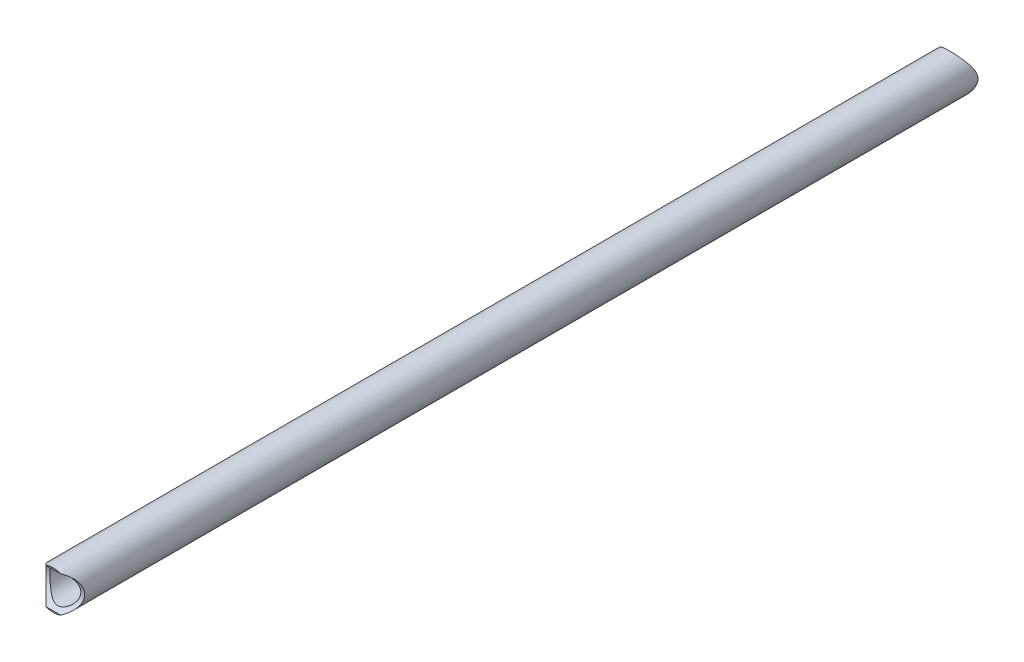
ISO-10303-21;
HEADER;
FILE_DESCRIPTION(('STEP AP214'),'2;1');
FILE_NAME('part.step','',(''),(''),'','','');
FILE_SCHEMA(('AUTOMOTIVE_DESIGN { 1 0 10303 214 1 1 1 1 }'));
ENDSEC;
DATA;
#1=APPLICATION_CONTEXT('core data for automotive mechanical design processes');
#2=APPLICATION_PROTOCOL_DEFINITION('international standard','automotive_design',2000,#1);
#3=PRODUCT_CONTEXT('',#1,'mechanical');
#4=PRODUCT('Part','Part','',(#3));
#5=PRODUCT_RELATED_PRODUCT_CATEGORY('part','',(#4));
#6=PRODUCT_DEFINITION_FORMATION('','',#4);
#7=PRODUCT_DEFINITION_CONTEXT('part definition',#1,'design');
#8=PRODUCT_DEFINITION('design','',#6,#7);
#9=PRODUCT_DEFINITION_SHAPE('','',#8);
#10=(LENGTH_UNIT() NAMED_UNIT(*) SI_UNIT(.MILLI.,.METRE.));
#11=(NAMED_UNIT(*) PLANE_ANGLE_UNIT() SI_UNIT($,.RADIAN.));
#12=(NAMED_UNIT(*) SI_UNIT($,.STERADIAN.) SOLID_ANGLE_UNIT());
#13=UNCERTAINTY_MEASURE_WITH_UNIT(LENGTH_MEASURE(1.E-05),#10,'distance_accuracy_value','');
#14=(GEOMETRIC_REPRESENTATION_CONTEXT(3) GLOBAL_UNCERTAINTY_ASSIGNED_CONTEXT((#13)) GLOBAL_UNIT_ASSIGNED_CONTEXT((#10,
#11,#12)) REPRESENTATION_CONTEXT('',''));
#15=CARTESIAN_POINT('',(0.,0.,0.));
#16=DIRECTION('',(0.,0.,1.));
#17=DIRECTION('',(1.,0.,0.));
#18=AXIS2_PLACEMENT_3D('',#15,#16,#17);
#19=CARTESIAN_POINT('',(6.35000000000003,-16.7005,793.75));
#20=DIRECTION('',(0.,0.,-1.));
#21=DIRECTION('',(-1.,0.,0.));
#22=AXIS2_PLACEMENT_3D('',#19,#20,#21);
#23=PLANE('',#22);
#24=DIRECTION('',(1.,0.,0.));
#25=VECTOR('',#24,1.);
#26=CARTESIAN_POINT('',(-16.7005,-15.4461710546658,793.75));
#27=LINE('',#26,#25);
#28=CARTESIAN_POINT('',(-6.35000000000032,-15.4461710546658,793.75));
#29=VERTEX_POINT('',#28);
#30=CARTESIAN_POINT('',(6.35000000000032,-15.4461710546658,793.75));
#31=VERTEX_POINT('',#30);
#32=EDGE_CURVE('E30',#29,#31,#27,.T.);
#33=ORIENTED_EDGE('',*,*,#32,.F.);
#34=CARTESIAN_POINT('',(0.,0.,793.75));
#35=DIRECTION('',(0.,0.,-1.));
#36=DIRECTION('',(-1.,0.,0.));
#37=AXIS2_PLACEMENT_3D('',#34,#35,#36);
#38=CIRCLE('',#37,16.7005);
#39=EDGE_CURVE('E39',#31,#29,#38,.T.);
#40=ORIENTED_EDGE('',*,*,#39,.F.);
#41=EDGE_LOOP('',(#33,#40));
#42=FACE_BOUND('',#41,.T.);
#43=ADVANCED_FACE('F16',(#42),#23,.F.);
#44=CARTESIAN_POINT('',(6.35000000000003,-16.7005,793.75));
#45=DIRECTION('',(0.,0.,-1.));
#46=DIRECTION('',(-1.,0.,0.));
#47=AXIS2_PLACEMENT_3D('',#44,#45,#46);
#48=PLANE('',#47);
#49=CARTESIAN_POINT('',(0.,0.,793.75));
#50=DIRECTION('',(0.,0.,-1.));
#51=DIRECTION('',(-1.,0.,0.));
#52=AXIS2_PLACEMENT_3D('',#49,#50,#51);
#53=CIRCLE('',#52,16.7005);
#54=CARTESIAN_POINT('',(-6.35000000000032,15.4461710546658,793.75));
#55=VERTEX_POINT('',#54);
#56=CARTESIAN_POINT('',(6.35000000000032,15.4461710546658,793.75));
#57=VERTEX_POINT('',#56);
#58=EDGE_CURVE('E47',#55,#57,#53,.T.);
#59=ORIENTED_EDGE('',*,*,#58,.F.);
#60=DIRECTION('',(1.,0.,0.));
#61=VECTOR('',#60,1.);
#62=CARTESIAN_POINT('',(-16.7005,15.4461710546658,793.75));
#63=LINE('',#62,#61);
#64=EDGE_CURVE('E10',#57,#55,#63,.F.);
#65=ORIENTED_EDGE('',*,*,#64,.F.);
#66=EDGE_LOOP('',(#59,#65));
#67=FACE_BOUND('',#66,.T.);
#68=ADVANCED_FACE('F56',(#67),#48,.F.);
#69=CARTESIAN_POINT('',(-16.7005,0.,800.1));
#70=DIRECTION('',(1.,0.,0.));
#71=DIRECTION('',(0.,1.,0.));
#72=AXIS2_PLACEMENT_3D('',#69,#70,#71);
#73=CYLINDRICAL_SURFACE('',#72,16.7005);
#74=ORIENTED_EDGE('',*,*,#64,.T.);
#75=CARTESIAN_POINT('',(0.,0.,800.1));
#76=DIRECTION('',(-0.707106781186547,0.,0.707106781186547));
#77=DIRECTION('',(0.707106781186547,0.,0.707106781186547));
#78=AXIS2_PLACEMENT_3D('',#75,#76,#77);
#79=ELLIPSE('',#78,23.6180735984119,16.7005);
#80=EDGE_CURVE('E53',#29,#55,#79,.F.);
#81=ORIENTED_EDGE('',*,*,#80,.F.);
#82=ORIENTED_EDGE('',*,*,#32,.T.);
#83=CARTESIAN_POINT('',(0.,0.,800.1));
#84=DIRECTION('',(0.707106781186547,0.,0.707106781186547));
#85=DIRECTION('',(-0.707106781186547,0.,0.707106781186547));
#86=AXIS2_PLACEMENT_3D('',#83,#84,#85);
#87=ELLIPSE('',#86,23.6180735984119,16.7005);
#88=EDGE_CURVE('E51',#57,#31,#87,.F.);
#89=ORIENTED_EDGE('',*,*,#88,.F.);
#90=EDGE_LOOP('',(#74,#81,#82,#89));
#91=FACE_BOUND('',#90,.T.);
#92=CARTESIAN_POINT('',(0.,13.3223,790.029100191145));
#93=CARTESIAN_POINT('',(0.251418143500063,13.3223022843708,790.029105573511));
#94=CARTESIAN_POINT('',(0.502811293762393,13.315168722087,790.019646331603));
#95=CARTESIAN_POINT('',(1.00339356073243,13.2868247388992,789.982315522625));
#96=CARTESIAN_POINT('',(1.2525828654249,13.2656155305941,789.954445541618));
#97=CARTESIAN_POINT('',(1.74736485458092,13.2095619602766,789.8815720937));
#98=CARTESIAN_POINT('',(1.99294933205381,13.1746903626753,789.836534408339));
#99=CARTESIAN_POINT('',(2.47865035470144,13.092009190743,789.731274830452));
#100=CARTESIAN_POINT('',(2.71876504043031,13.0441952858102,789.671047855928));
#101=CARTESIAN_POINT('',(3.27462578986354,12.9177201172076,789.514513766992));
#102=CARTESIAN_POINT('',(3.58776375820545,12.8341105283272,789.412934977466));
#103=CARTESIAN_POINT('',(4.2012725463173,12.6465806454139,789.191667867289));
#104=CARTESIAN_POINT('',(4.50163821678404,12.5426522523861,789.071972329683));
#105=CARTESIAN_POINT('',(5.09001280108557,12.3156449633207,788.819019161269));
#106=CARTESIAN_POINT('',(5.37799045091784,12.1925208700848,788.685729786044));
#107=CARTESIAN_POINT('',(5.94093329980693,11.9283554466745,788.409938872621));
#108=CARTESIAN_POINT('',(6.21589865064841,11.7873143255679,788.267437441924));
#109=CARTESIAN_POINT('',(6.8488864619948,11.434618334165,787.924769458563));
#110=CARTESIAN_POINT('',(7.20156650728618,11.2157165682894,787.722158571065));
#111=CARTESIAN_POINT('',(7.88371776304453,10.7471818668879,787.313225526753));
#112=CARTESIAN_POINT('',(8.21318075270779,10.4975381312124,787.106902087521));
#113=CARTESIAN_POINT('',(8.84806966939785,9.96824901074904,786.696538331912));
#114=CARTESIAN_POINT('',(9.15351433918057,9.68862743019639,786.49249634404));
#115=CARTESIAN_POINT('',(9.73930744068204,9.09956019954306,786.091732679595));
#116=CARTESIAN_POINT('',(10.0196641269316,8.79012442911116,785.895008607799));
#117=CARTESIAN_POINT('',(10.5008423920522,8.20547294017993,785.551175902973));
#118=CARTESIAN_POINT('',(10.7064708670409,7.93547114854487,785.401910676446));
#119=CARTESIAN_POINT('',(11.0987661821715,7.37682281423737,785.113742360671));
#120=CARTESIAN_POINT('',(11.2854366739121,7.08817987972423,784.974837277275));
#121=CARTESIAN_POINT('',(11.6379110681395,6.49323527631225,784.710052309959));
#122=CARTESIAN_POINT('',(11.8037395993659,6.18695508561284,784.584157084314));
#123=CARTESIAN_POINT('',(12.1128258466353,5.55751622852178,784.347741045362));
#124=CARTESIAN_POINT('',(12.2560872832031,5.23436035606173,784.237217698122));
#125=CARTESIAN_POINT('',(12.4968974840104,4.62605154757629,784.050368325039));
#126=CARTESIAN_POINT('',(12.5980925515534,4.34314964550615,783.971401259523));
#127=CARTESIAN_POINT('',(12.7819172205302,3.76794233665672,783.827410677803));
#128=CARTESIAN_POINT('',(12.8645503449827,3.47563872636243,783.76238451575));
#129=CARTESIAN_POINT('',(13.0101137461755,2.88332875196882,783.647520429974));
#130=CARTESIAN_POINT('',(13.0730505855828,2.58332498963362,783.597677447467));
#131=CARTESIAN_POINT('',(13.1783068439696,1.9774800123123,783.514169706928));
#132=CARTESIAN_POINT('',(13.2206260161555,1.67163872749649,783.480505142551));
#133=CARTESIAN_POINT('',(13.2840628144823,1.05529732744199,783.429997687371));
#134=CARTESIAN_POINT('',(13.3051065163602,0.744784746931274,783.41321345041));
#135=CARTESIAN_POINT('',(13.325371652977,0.122591545373567,783.397050711049));
#136=CARTESIAN_POINT('',(13.3245930460588,-0.189089077901996,783.397672241876));
#137=CARTESIAN_POINT('',(13.3012271283397,-0.811115504501877,783.416306854107));
#138=CARTESIAN_POINT('',(13.2786390010252,-1.12146125741384,783.43432058665));
#139=CARTESIAN_POINT('',(13.2120407141424,-1.73836345548134,783.487335049311));
#140=CARTESIAN_POINT('',(13.168031033991,-2.04491998528268,783.522335399269));
#141=CARTESIAN_POINT('',(13.0622432818108,-2.63564529534353,783.606236163795));
#142=CARTESIAN_POINT('',(13.0015491768649,-2.92013092342888,783.654286942744));
#143=CARTESIAN_POINT('',(12.8624621699321,-3.48202701063414,783.764023430466));
#144=CARTESIAN_POINT('',(12.7840700518669,-3.7594377825245,783.825708535313));
#145=CARTESIAN_POINT('',(12.6105537381185,-4.30578333855928,783.961654896974));
#146=CARTESIAN_POINT('',(12.5154299542742,-4.57471833113735,784.03591584424));
#147=CARTESIAN_POINT('',(12.3094530772396,-5.10308574066138,784.195866980435));
#148=CARTESIAN_POINT('',(12.1985942291035,-5.36251463697377,784.281561350334));
#149=CARTESIAN_POINT('',(11.9508087552412,-5.89545039377878,784.471885546172));
#150=CARTESIAN_POINT('',(11.8123988735205,-6.16789944276703,784.577544667385));
#151=CARTESIAN_POINT('',(11.5192374839682,-6.69948001358181,784.799455041338));
#152=CARTESIAN_POINT('',(11.3644792235541,-6.95860596618134,784.915710668147));
#153=CARTESIAN_POINT('',(11.0398574678804,-7.46291984015719,785.157118963071));
#154=CARTESIAN_POINT('',(10.869991320127,-7.70810530156341,785.282273192736));
#155=CARTESIAN_POINT('',(10.5162313045658,-8.18416297618832,785.539799548985));
#156=CARTESIAN_POINT('',(10.3323355514131,-8.41503325810207,785.672172644979));
#157=CARTESIAN_POINT('',(9.91221062050688,-8.90826660816844,785.970289547353));
#158=CARTESIAN_POINT('',(9.67299980599332,-9.16733289213353,786.137294629016));
#159=CARTESIAN_POINT('',(9.17668619581054,-9.66413138458368,786.47642700289));
#160=CARTESIAN_POINT('',(8.91958043166294,-9.90186003845925,786.648555142208));
#161=CARTESIAN_POINT('',(8.3879898665765,-10.3560450780743,786.995012842881));
#162=CARTESIAN_POINT('',(8.11348561530668,-10.5724769403747,787.16934468718));
#163=CARTESIAN_POINT('',(7.54777686996107,-10.98348665511,787.516595767305));
#164=CARTESIAN_POINT('',(7.25657445325045,-11.1780672171231,787.689515175803));
#165=CARTESIAN_POINT('',(6.68818598986023,-11.5261100140998,788.012570764624));
#166=CARTESIAN_POINT('',(6.41262328051092,-11.6817425808608,788.163225333284));
#167=CARTESIAN_POINT('',(5.84781146813719,-11.9744711681619,788.456902909549));
#168=CARTESIAN_POINT('',(5.55856090563278,-12.1115652059752,788.599925099871));
#169=CARTESIAN_POINT('',(4.9667018898561,-12.366048087,788.874027100627));
#170=CARTESIAN_POINT('',(4.66411729595765,-12.4834704551977,789.00512705124));
#171=CARTESIAN_POINT('',(4.04518266334873,-12.697530388079,789.250762177573));
#172=CARTESIAN_POINT('',(3.72883883549669,-12.7941772160493,789.365304728325));
#173=CARTESIAN_POINT('',(3.17897999564326,-12.9395862594658,789.541461999185));
#174=CARTESIAN_POINT('',(2.94876385555754,-12.9940455688101,789.608693369207));
#175=CARTESIAN_POINT('',(2.48248847766143,-13.0911266038004,789.73008438146));
#176=CARTESIAN_POINT('',(2.24643114282433,-13.1337521308252,789.784248220654));
#177=CARTESIAN_POINT('',(1.76985020966279,-13.2064109950073,789.877431316035));
#178=CARTESIAN_POINT('',(1.52933537855165,-13.2364667736619,789.916477553214));
#179=CARTESIAN_POINT('',(1.04489137463391,-13.2834892177118,789.977889355234));
#180=CARTESIAN_POINT('',(0.800962273049025,-13.3004561557274,790.000255267501));
#181=CARTESIAN_POINT('',(0.310169920058792,-13.3209655979565,790.027320363423));
#182=CARTESIAN_POINT('',(0.0632978839863078,-13.3244321843177,790.03191963703));
#183=CARTESIAN_POINT('',(-0.429916268091981,-13.3176454396277,790.022944449436));
#184=CARTESIAN_POINT('',(-0.676258391564738,-13.3073923031851,790.009370246018));
#185=CARTESIAN_POINT('',(-1.16668953432506,-13.273394972809,789.964692229072));
#186=CARTESIAN_POINT('',(-1.41077544456561,-13.2496343652269,789.933567088837));
#187=CARTESIAN_POINT('',(-1.89470167325921,-13.1891350878875,789.855203873802));
#188=CARTESIAN_POINT('',(-2.13454133425005,-13.1523944265195,789.807963326352));
#189=CARTESIAN_POINT('',(-2.67043743013827,-13.055444340755,789.685122112423));
#190=CARTESIAN_POINT('',(-2.96488067924528,-12.9916156658253,789.605340371646));
#191=CARTESIAN_POINT('',(-3.54353431865181,-12.8458618316345,789.427431242282));
#192=CARTESIAN_POINT('',(-3.82774143977861,-12.7639309495355,789.329298053573));
#193=CARTESIAN_POINT('',(-4.38594703910564,-12.583061599392,789.118534933514));
#194=CARTESIAN_POINT('',(-4.65991896444461,-12.4840821897832,789.005870272733));
#195=CARTESIAN_POINT('',(-5.19680621280201,-12.2703048545864,788.769876716961));
#196=CARTESIAN_POINT('',(-5.45972105744584,-12.1555062455121,788.646547361275));
#197=CARTESIAN_POINT('',(-6.09016044800806,-11.8559772340731,788.33532084713));
#198=CARTESIAN_POINT('',(-6.45172372019426,-11.6629726111795,788.143270483761));
#199=CARTESIAN_POINT('',(-7.15248845881097,-11.2468532321984,787.751037159809));
#200=CARTESIAN_POINT('',(-7.4916808769059,-11.02372640242,787.550850960796));
#201=CARTESIAN_POINT('',(-8.14795348263761,-10.5479343203214,787.148359741947));
#202=CARTESIAN_POINT('',(-8.46501211173736,-10.2952408934805,786.946052871149));
#203=CARTESIAN_POINT('',(-9.07595588785146,-9.76090905635818,786.544816663838));
#204=CARTESIAN_POINT('',(-9.36984458613351,-9.4792750971092,786.34588681341));
#205=CARTESIAN_POINT('',(-9.93683779168639,-8.8833704905327,785.953574302748));
#206=CARTESIAN_POINT('',(-10.2096176292959,-8.56871889612707,785.760299190767));
#207=CARTESIAN_POINT('',(-10.72785141761,-7.91027072875493,785.38682312133));
#208=CARTESIAN_POINT('',(-10.9733011389647,-7.56646965935186,785.206624188919));
#209=CARTESIAN_POINT('',(-11.4332199774545,-6.85166205140224,784.864580944834));
#210=CARTESIAN_POINT('',(-11.6477726953281,-6.48073318353383,784.702687368182));
#211=CARTESIAN_POINT('',(-12.0430648751614,-5.71266358035515,784.401527119461));
#212=CARTESIAN_POINT('',(-12.2238235736237,-5.3155379322344,784.262247580826));
#213=CARTESIAN_POINT('',(-12.4953516830537,-4.63017335700708,784.051570520136));
#214=CARTESIAN_POINT('',(-12.5963283907563,-4.34820053067249,783.972778718469));
#215=CARTESIAN_POINT('',(-12.7798386638517,-3.77490569845395,783.829043150216));
#216=CARTESIAN_POINT('',(-12.8623770210168,-3.48358614416395,783.764095785928));
#217=CARTESIAN_POINT('',(-13.0078678041303,-2.89333645974655,783.649296290145));
#218=CARTESIAN_POINT('',(-13.0708305992168,-2.5944104498405,783.599436167344));
#219=CARTESIAN_POINT('',(-13.1762884157818,-1.99072341644611,783.515773544256));
#220=CARTESIAN_POINT('',(-13.2187826965146,-1.68596218219871,783.481971625108));
#221=CARTESIAN_POINT('',(-13.2827219293065,-1.07174753240306,783.431066373826));
#222=CARTESIAN_POINT('',(-13.3040919429578,-0.762281338595039,783.414022492017));
#223=CARTESIAN_POINT('',(-13.3251538129713,-0.142140924713737,783.397224590726));
#224=CARTESIAN_POINT('',(-13.3248457583348,0.168533290394653,783.397470500259));
#225=CARTESIAN_POINT('',(-13.302556580212,0.788625979462834,783.415246783976));
#226=CARTESIAN_POINT('',(-13.2805737344486,1.09804435167163,783.432778531692));
#227=CARTESIAN_POINT('',(-13.2153077585039,1.71317834877011,783.484736165546));
#228=CARTESIAN_POINT('',(-13.1720250434862,2.01889404571101,783.519161722401));
#229=CARTESIAN_POINT('',(-13.0676009318225,2.60895435014108,783.601992167692));
#230=CARTESIAN_POINT('',(-13.0074817075329,2.89359424390573,783.649595510684));
#231=CARTESIAN_POINT('',(-12.8695210762881,3.45584951803272,783.75846394116));
#232=CARTESIAN_POINT('',(-12.7916804137679,3.7334651929214,783.819728454769));
#233=CARTESIAN_POINT('',(-12.6192395905063,4.28026388297332,783.95486565258));
#234=CARTESIAN_POINT('',(-12.5246397777823,4.54944707310729,784.028738074967));
#235=CARTESIAN_POINT('',(-12.319682036264,5.07834513386465,784.187947240024));
#236=CARTESIAN_POINT('',(-12.2093183375125,5.33805649368515,784.273288179764));
#237=CARTESIAN_POINT('',(-11.9626774379795,5.87131655701227,784.462805210544));
#238=CARTESIAN_POINT('',(-11.8249327634229,6.14382340634777,784.568001349042));
#239=CARTESIAN_POINT('',(-11.533102341183,6.67557225973804,784.789010861412));
#240=CARTESIAN_POINT('',(-11.3790098443269,6.93480871914061,784.904828617707));
#241=CARTESIAN_POINT('',(-11.0557186899752,7.43939264187098,785.145393004403));
#242=CARTESIAN_POINT('',(-10.8865172777513,7.68473755904829,785.27014126223));
#243=CARTESIAN_POINT('',(-10.5340880539812,8.16115706344395,785.526892482345));
#244=CARTESIAN_POINT('',(-10.3508583548459,8.39222972266106,785.658896420252));
#245=CARTESIAN_POINT('',(-9.93228458047715,8.88586217152212,785.95619124346));
#246=CARTESIAN_POINT('',(-9.69396627295113,9.14514133178584,786.122750355446));
#247=CARTESIAN_POINT('',(-9.19946404739437,9.64243434741757,786.461062342446));
#248=CARTESIAN_POINT('',(-8.94327724976112,9.88044476104942,786.632816052061));
#249=CARTESIAN_POINT('',(-8.41359707416463,10.3352328926814,786.978592822194));
#250=CARTESIAN_POINT('',(-8.14008672465548,10.5519892418839,787.152617971265));
#251=CARTESIAN_POINT('',(-7.5764121689563,10.9637345825342,787.499379575858));
#252=CARTESIAN_POINT('',(-7.28624974838461,11.1587259012891,787.672116167317));
#253=CARTESIAN_POINT('',(-6.71834841090572,11.5085877494037,787.995858094398));
#254=CARTESIAN_POINT('',(-6.44215048597998,11.6655161270902,788.147341792226));
#255=CARTESIAN_POINT('',(-5.87599491910147,11.9606981897758,788.442728134272));
#256=CARTESIAN_POINT('',(-5.58603645653196,12.0989507591377,788.58663032528));
#257=CARTESIAN_POINT('',(-4.99232911285816,12.3557602630059,788.86267935805));
#258=CARTESIAN_POINT('',(-4.68859184469429,12.4743334048252,788.994835831101));
#259=CARTESIAN_POINT('',(-4.2226517252619,12.636451723924,789.180587576664));
#260=CARTESIAN_POINT('',(-4.06563112084154,12.6878635336616,789.240419328905));
#261=CARTESIAN_POINT('',(-3.74810285151838,12.7852648682294,789.355263268751));
#262=CARTESIAN_POINT('',(-3.5875938356102,12.8312522462964,789.41027354602));
#263=CARTESIAN_POINT('',(-3.15392994399325,12.9466322556904,789.54991570163));
#264=CARTESIAN_POINT('',(-2.87774279418708,13.0109181280207,789.629533149368));
#265=CARTESIAN_POINT('',(-2.31722139310471,13.122337625915,789.769511470008));
#266=CARTESIAN_POINT('',(-2.03289086615568,13.1694789614589,789.829880997281));
#267=CARTESIAN_POINT('',(-1.45882116723091,13.2453399364385,789.92790426425));
#268=CARTESIAN_POINT('',(-1.16910286160045,13.2741196587627,789.965632067905));
#269=CARTESIAN_POINT('',(-0.586244542694648,13.3125962850914,790.016224191842));
#270=CARTESIAN_POINT('',(-0.293105287088521,13.3222973368622,790.02909391634));
#271=CARTESIAN_POINT('',(0.,13.3223,790.029100191145));
#272=B_SPLINE_CURVE_WITH_KNOTS('',3,(#92,#93,#94,#95,#96,#97,#98,#99,#100,#101,#102,#103,#104,
#105,#106,#107,#108,#109,#110,#111,#112,#113,#114,#115,#116,#117,#118,#119,#120,#121,#122,#123,
#124,#125,#126,#127,#128,#129,#130,#131,#132,#133,#134,#135,#136,#137,#138,#139,#140,#141,#142,
#143,#144,#145,#146,#147,#148,#149,#150,#151,#152,#153,#154,#155,#156,#157,#158,#159,#160,#161,
#162,#163,#164,#165,#166,#167,#168,#169,#170,#171,#172,#173,#174,#175,#176,#177,#178,#179,#180,
#181,#182,#183,#184,#185,#186,#187,#188,#189,#190,#191,#192,#193,#194,#195,#196,#197,#198,#199,
#200,#201,#202,#203,#204,#205,#206,#207,#208,#209,#210,#211,#212,#213,#214,#215,#216,#217,#218,
#219,#220,#221,#222,#223,#224,#225,#226,#227,#228,#229,#230,#231,#232,#233,#234,#235,#236,#237,
#238,#239,#240,#241,#242,#243,#244,#245,#246,#247,#248,#249,#250,#251,#252,#253,#254,#255,#256,
#257,#258,#259,#260,#261,#262,#263,#264,#265,#266,#267,#268,#269,#270,#271),.UNSPECIFIED.,.T.,
.F.,(4,2,2,2,2,2,2,2,2,2,2,2,2,2,2,2,2,2,2,2,2,2,2,2,2,2,2,2,2,2,2,2,2,2,2,2,2,2,2,2,2,2,2,2,2,
2,2,2,2,2,2,2,2,2,2,2,2,2,2,2,2,2,2,2,2,2,2,2,2,2,2,2,2,2,2,2,2,2,2,2,2,2,2,2,2,2,2,2,2,4),(0.,
0.753939053734585,1.50781316501343,2.26319781287559,3.01883553173926,4.03618227752006,
5.05393536348488,6.07412203304001,7.09429679948219,8.47822083041249,9.86263245071177,
11.2459527938819,12.6288163059794,13.7401029793392,14.8511751942237,15.9609218685542,
17.0704853925514,18.0015271162719,18.9323919806002,19.8629463561121,20.7935118700988,
21.7272997507215,22.6610894138782,23.5949140379804,24.5287177639432,25.4122561187822,
26.2957553455584,27.1792328286246,28.0630342715602,29.0321340522578,30.0016356895669,
30.9713078796869,31.9411106078913,33.1104957272026,34.2800752927715,35.4509862542923,
36.6217518612506,37.6724993891425,38.7233592075191,39.7724094909818,40.8209910548434,
41.5581972147828,42.2951662864399,43.0308139289688,43.7664462486832,44.5062093988458,
45.2459620558771,45.986615553176,46.7273827429545,47.6609264536289,48.5947657185013,
49.5308796623542,50.4670340647549,51.8230024334319,53.1795159289033,54.5373327616512,
55.8949410748523,57.2704275281882,58.6461265438159,60.0180303014355,61.3891507393423,
62.3173548010803,63.2453173591016,64.1727875363498,65.1002912757801,66.0310736546019,
66.9618522120029,67.8927047349441,68.8235391150133,69.7069510439299,70.5903258696841,
71.4736823535996,72.3573629995154,73.3253037649046,74.2936457097676,75.2621645691658,
76.2308139783262,77.3984136624843,78.5662019482731,79.7351525400556,80.9039780174549,
81.9590039009019,83.0140927806168,84.0683083659165,84.5953177867068,85.1225350809317,
86.004972971528,86.8870135334627,87.7661528749165,88.6451010674207),.UNSPECIFIED.);
#273=CARTESIAN_POINT('',(0.,13.3223,790.029100191145));
#274=VERTEX_POINT('',#273);
#275=EDGE_CURVE('E73',#274,#274,#272,.F.);
#276=ORIENTED_EDGE('',*,*,#275,.F.);
#277=EDGE_LOOP('',(#276));
#278=FACE_BOUND('',#277,.T.);
#279=ADVANCED_FACE('F59',(#91,#278),#73,.F.);
#280=CARTESIAN_POINT('',(0.,0.,0.));
#281=DIRECTION('',(0.,-1.,0.));
#282=DIRECTION('',(0.,0.,-1.));
#283=AXIS2_PLACEMENT_3D('',#280,#281,#282);
#284=CYLINDRICAL_SURFACE('',#283,21.082);
#285=CARTESIAN_POINT('',(16.7005,0.,12.8663912481317));
#286=CARTESIAN_POINT('',(16.700501651617,-0.318048689825933,12.8663873917433));
#287=CARTESIAN_POINT('',(16.6913959959469,-0.636078058233101,12.878233728294));
#288=CARTESIAN_POINT('',(16.6552091317132,-1.26936872938503,12.9249990641684));
#289=CARTESIAN_POINT('',(16.6281288319816,-1.58463017126487,12.9599168969529));
#290=CARTESIAN_POINT('',(16.556552223082,-2.21059640241425,13.0512314661233));
#291=CARTESIAN_POINT('',(16.5120227972951,-2.52129135473047,13.1076690392102));
#292=CARTESIAN_POINT('',(16.406435560555,-3.13573086215765,13.2395887943427));
#293=CARTESIAN_POINT('',(16.3453749130287,-3.43947421474206,13.3150742446402));
#294=CARTESIAN_POINT('',(16.1842492768174,-4.14084876098796,13.5108048361985));
#295=CARTESIAN_POINT('',(16.077982364405,-4.53524728481028,13.6375397082877));
#296=CARTESIAN_POINT('',(15.8396836474816,-5.30799392340751,13.9136035044063));
#297=CARTESIAN_POINT('',(15.7076417804045,-5.68633569915751,14.0629412474859));
#298=CARTESIAN_POINT('',(15.4192499567052,-6.42743384951334,14.3785690320073));
#299=CARTESIAN_POINT('',(15.2628423194377,-6.79015056507849,14.5448989685858));
#300=CARTESIAN_POINT('',(14.9272840463478,-7.49911362250995,14.8890808174978));
#301=CARTESIAN_POINT('',(14.7481336137038,-7.84536011147893,15.066932626891));
#302=CARTESIAN_POINT('',(14.3024041651075,-8.63829840289962,15.4924732494015));
#303=CARTESIAN_POINT('',(14.0269775406112,-9.07846296782939,15.743098898961));
#304=CARTESIAN_POINT('',(13.4378225813671,-9.92973408775898,16.2488946386916));
#305=CARTESIAN_POINT('',(13.1240811814276,-10.3408306548058,16.5040662535432));
#306=CARTESIAN_POINT('',(12.4592472119749,-11.1328767461881,17.01154509946));
#307=CARTESIAN_POINT('',(12.1081844373139,-11.5138499015276,17.2638544400926));
#308=CARTESIAN_POINT('',(11.3689722747507,-12.2443047785302,17.7593665534507));
#309=CARTESIAN_POINT('',(10.9808349094774,-12.5937966380637,18.0025722429587));
#310=CARTESIAN_POINT('',(10.246856978174,-13.1942295023333,18.4281327972869));
#311=CARTESIAN_POINT('',(9.90742040228808,-13.4511353391158,18.6131389279361));
#312=CARTESIAN_POINT('',(9.2052426848626,-13.9410699521921,18.9702218281539));
#313=CARTESIAN_POINT('',(8.84250262469103,-14.1740998351184,19.1422991968622));
#314=CARTESIAN_POINT('',(8.09505502437904,-14.6138480285565,19.4701604131554));
#315=CARTESIAN_POINT('',(7.7103755682354,-14.8205989295075,19.6259643988977));
#316=CARTESIAN_POINT('',(6.92003928515724,-15.2056855933979,19.9183633517524));
#317=CARTESIAN_POINT('',(6.51438587820195,-15.3840259696791,20.0549614371226));
#318=CARTESIAN_POINT('',(5.75026126756025,-15.683807125484,20.2859119874366));
#319=CARTESIAN_POINT('',(5.39455250044627,-15.8097863364325,20.3835280358246));
#320=CARTESIAN_POINT('',(4.67143177476956,-16.0383338840936,20.5612989461302));
#321=CARTESIAN_POINT('',(4.30402100750051,-16.1409045952257,20.6414555789898));
#322=CARTESIAN_POINT('',(3.55969655452295,-16.3212078930991,20.7827504146704));
#323=CARTESIAN_POINT('',(3.18278649496967,-16.3989498072969,20.8438957592501));
#324=CARTESIAN_POINT('',(2.4218032502431,-16.5284760682203,20.9459531252307));
#325=CARTESIAN_POINT('',(2.0377299788854,-16.5802601024235,20.9868649030276));
#326=CARTESIAN_POINT('',(1.26394853613976,-16.6571543818868,21.0476663371774));
#327=CARTESIAN_POINT('',(0.874225795711741,-16.6821746677361,21.0674850936837));
#328=CARTESIAN_POINT('',(0.0934815880961315,-16.7048039829193,21.0854085011731));
#329=CARTESIAN_POINT('',(-0.297539881527446,-16.7024129608096,21.0835131114047));
#330=CARTESIAN_POINT('',(-1.07775822907055,-16.670260832553,21.0580513010129));
#331=CARTESIAN_POINT('',(-1.46695501820661,-16.6404984082069,21.0344838366684));
#332=CARTESIAN_POINT('',(-2.24046061871697,-16.5541076339679,20.9662062207014));
#333=CARTESIAN_POINT('',(-2.62476953138165,-16.4974798417346,20.9214965079407));
#334=CARTESIAN_POINT('',(-3.36595716497834,-16.3618931457417,20.8147525142177));
#335=CARTESIAN_POINT('',(-3.72322478696742,-16.2842447345686,20.7537370105179));
#336=CARTESIAN_POINT('',(-4.42876565574087,-16.1066776484362,20.6147044373035));
#337=CARTESIAN_POINT('',(-4.77703928705759,-16.006759927352,20.5366880959994));
#338=CARTESIAN_POINT('',(-5.46288298696909,-15.7858617455712,20.3649853151274));
#339=CARTESIAN_POINT('',(-5.80045212790357,-15.6648794652666,20.2712975218488));
#340=CARTESIAN_POINT('',(-6.46349157949888,-15.4031504972252,20.0697309820339));
#341=CARTESIAN_POINT('',(-6.78896023061739,-15.2624011110486,19.9618502981304));
#342=CARTESIAN_POINT('',(-7.45803660736237,-14.9477144408192,19.7222407688445));
#343=CARTESIAN_POINT('',(-7.80028273182769,-14.771874867815,19.5892101053885));
#344=CARTESIAN_POINT('',(-8.46779474930284,-14.3996258832921,19.3100514694989));
#345=CARTESIAN_POINT('',(-8.79305971576124,-14.2032153511039,19.1639227835708));
#346=CARTESIAN_POINT('',(-9.42603574881757,-13.791272704257,18.8606410730861));
#347=CARTESIAN_POINT('',(-9.73373976511962,-13.5757329972033,18.7034836764455));
#348=CARTESIAN_POINT('',(-10.3310355839786,-13.1269183916845,18.3803090933934));
#349=CARTESIAN_POINT('',(-10.6206253345675,-12.8936414905733,18.2142909071728));
#350=CARTESIAN_POINT('',(-11.2389465364587,-12.360896534547,17.8407575035741));
#351=CARTESIAN_POINT('',(-11.5635215076674,-12.0576666498107,17.631715822124));
#352=CARTESIAN_POINT('',(-12.1856888122493,-11.4285380286701,17.2075996876857));
#353=CARTESIAN_POINT('',(-12.483276565549,-11.1026354609468,16.9925242187667));
#354=CARTESIAN_POINT('',(-13.0514882835474,-10.4287970356688,16.5601013148656));
#355=CARTESIAN_POINT('',(-13.3220829665062,-10.0808379062256,16.3427516892293));
#356=CARTESIAN_POINT('',(-13.8355433882297,-9.36370199013698,15.9104067113895));
#357=CARTESIAN_POINT('',(-14.0784128552644,-8.99452806635241,15.6954110461675));
#358=CARTESIAN_POINT('',(-14.5090787381799,-8.27929045136326,15.2974838615841));
#359=CARTESIAN_POINT('',(-14.6999945759619,-7.93555716771786,15.1137383531768));
#360=CARTESIAN_POINT('',(-15.0589359152759,-7.23127694571284,14.7561286042124));
#361=CARTESIAN_POINT('',(-15.2269593605258,-6.87072850085055,14.5822652521248));
#362=CARTESIAN_POINT('',(-15.5386367295555,-6.13330543738905,14.2496787227652));
#363=CARTESIAN_POINT('',(-15.6823324945151,-5.75646027869631,14.0909297604156));
#364=CARTESIAN_POINT('',(-15.944006998122,-4.9860464783198,13.7941477236687));
#365=CARTESIAN_POINT('',(-16.0619965058618,-4.59248492250696,13.6561059819979));
#366=CARTESIAN_POINT('',(-16.2405793140075,-3.90364687412951,13.4427608518797));
#367=CARTESIAN_POINT('',(-16.307957215658,-3.61219218652713,13.3607726231799));
#368=CARTESIAN_POINT('',(-16.4275469470861,-3.02208006034199,13.2134566832712));
#369=CARTESIAN_POINT('',(-16.4797635271719,-2.72342490962226,13.1481237544489));
#370=CARTESIAN_POINT('',(-16.5680987875878,-2.12070532915108,13.0366369347095));
#371=CARTESIAN_POINT('',(-16.604244860437,-1.81665102975389,12.9904504174862));
#372=CARTESIAN_POINT('',(-16.6598377177618,-1.20454264699297,12.9190788389297));
#373=CARTESIAN_POINT('',(-16.6792847988268,-0.896488634766445,12.8938934045981));
#374=CARTESIAN_POINT('',(-16.7010868754288,-0.277219204190502,12.8656423640751));
#375=CARTESIAN_POINT('',(-16.7033569139518,0.0340043141999877,12.862686705965));
#376=CARTESIAN_POINT('',(-16.6905260764593,0.655473620640899,12.8793309880759));
#377=CARTESIAN_POINT('',(-16.6754253802914,0.965719418780784,12.8989306947701));
#378=CARTESIAN_POINT('',(-16.6281800817812,1.5831360912126,12.9597769137203));
#379=CARTESIAN_POINT('',(-16.596014116721,1.89030261864608,13.0010505572745));
#380=CARTESIAN_POINT('',(-16.515310333516,2.49911581309073,13.1034143704594));
#381=CARTESIAN_POINT('',(-16.4667700170888,2.8007616303827,13.1645075639618));
#382=CARTESIAN_POINT('',(-16.3387002130721,3.47895656814934,13.3233127026583));
#383=CARTESIAN_POINT('',(-16.2543206410225,3.85331486677387,13.4264738735132));
#384=CARTESIAN_POINT('',(-16.0622126684386,4.5887509913602,13.6557079223735));
#385=CARTESIAN_POINT('',(-15.9544766542316,4.94982444176101,13.7817882693433));
#386=CARTESIAN_POINT('',(-15.7170466761651,5.65872926612365,14.0519593402889));
#387=CARTESIAN_POINT('',(-15.5873007902475,6.00652688857553,14.1960924359324));
#388=CARTESIAN_POINT('',(-15.3073659836329,6.68781696743424,14.4975037303306));
#389=CARTESIAN_POINT('',(-15.1571762718318,7.02130886960294,14.6547824376832));
#390=CARTESIAN_POINT('',(-14.7692272097316,7.81315039908071,15.0474488039445));
#391=CARTESIAN_POINT('',(-14.5214022213876,8.26423493376886,15.2875918215807));
#392=CARTESIAN_POINT('',(-13.9879350069465,9.1381928231956,15.7771886692278));
#393=CARTESIAN_POINT('',(-13.7022784892393,9.56105542529523,16.0266459922018));
#394=CARTESIAN_POINT('',(-13.0938498051449,10.3787116126544,16.5274690255778));
#395=CARTESIAN_POINT('',(-12.7710445709027,10.7734796758603,16.7788362472858));
#396=CARTESIAN_POINT('',(-12.0890683367024,11.5335054910505,17.2766725909176));
#397=CARTESIAN_POINT('',(-11.7299026813521,11.8987675659614,17.523142426354));
#398=CARTESIAN_POINT('',(-10.9715181600409,12.601687953773,18.0078075980411));
#399=CARTESIAN_POINT('',(-10.5719158223075,12.9390134279921,18.2458878375064));
#400=CARTESIAN_POINT('',(-9.73647589874634,13.5788301252783,18.7050542579474));
#401=CARTESIAN_POINT('',(-9.3006328827464,13.8813161118687,18.9261378826259));
#402=CARTESIAN_POINT('',(-8.39513210989653,14.4468801952228,19.344775363046));
#403=CARTESIAN_POINT('',(-7.9255716356719,14.7100654137341,19.542392867089));
#404=CARTESIAN_POINT('',(-7.19731935840765,15.0724532868862,19.8170813368229));
#405=CARTESIAN_POINT('',(-6.95062350463153,15.1878355139333,19.9050092277108));
#406=CARTESIAN_POINT('',(-6.44953596791651,15.4073034317559,20.0729674857473));
#407=CARTESIAN_POINT('',(-6.19514252203694,15.5113865093176,20.1529960255847));
#408=CARTESIAN_POINT('',(-5.58850270960066,15.742123762028,20.3310441859218));
#409=CARTESIAN_POINT('',(-5.23330546142895,15.8638435230263,20.4254935692793));
#410=CARTESIAN_POINT('',(-4.51172820359067,16.0839438789019,20.5969053717735));
#411=CARTESIAN_POINT('',(-4.14535110562109,16.1823304931231,20.6738723007111));
#412=CARTESIAN_POINT('',(-3.40359803049756,16.3544205439274,20.8088501637051));
#413=CARTESIAN_POINT('',(-3.02822692471347,16.4281370324666,20.8668711209056));
#414=CARTESIAN_POINT('',(-2.27076954163596,16.5498471001216,20.9628256560164));
#415=CARTESIAN_POINT('',(-1.88868301177858,16.5978397096271,21.0007584767437));
#416=CARTESIAN_POINT('',(-1.11938289881167,16.6674326009731,21.0558038754408));
#417=CARTESIAN_POINT('',(-0.732156901736672,16.6889487293993,21.0728500661707));
#418=CARTESIAN_POINT('',(0.043204504981922,16.7049451075738,21.0855208771548));
#419=CARTESIAN_POINT('',(0.431339910592508,16.6994254769932,21.0811455922291));
#420=CARTESIAN_POINT('',(1.20549610108005,16.6614433499555,21.0510708685619));
#421=CARTESIAN_POINT('',(1.59151663713242,16.628977748906,21.0253689726652));
#422=CARTESIAN_POINT('',(2.35843983195101,16.5376416882991,20.953205799383));
#423=CARTESIAN_POINT('',(2.7393425623507,16.4787715987203,20.906744812873));
#424=CARTESIAN_POINT('',(3.47653064006858,16.3387543610254,20.796565615652));
#425=CARTESIAN_POINT('',(3.83315703418039,16.258715546456,20.7337076877095));
#426=CARTESIAN_POINT('',(4.53720988902331,16.0764627980447,20.5911014899583));
#427=CARTESIAN_POINT('',(4.88463669251061,15.9742496916755,20.5113538504213));
#428=CARTESIAN_POINT('',(5.56861372568991,15.748870531723,20.3363199108091));
#429=CARTESIAN_POINT('',(5.90516299606031,15.625702636043,20.2410322446695));
#430=CARTESIAN_POINT('',(6.56602190545001,15.3597189063707,20.0364111096677));
#431=CARTESIAN_POINT('',(6.89032985410818,15.2169003714472,19.9270757101167));
#432=CARTESIAN_POINT('',(7.55805330288437,14.8974204202017,19.6841387193259));
#433=CARTESIAN_POINT('',(7.90004062352913,14.7187926095879,19.5491993753862));
#434=CARTESIAN_POINT('',(8.56681616378846,14.340963558524,19.2663326131071));
#435=CARTESIAN_POINT('',(8.89160340183399,14.1417611458385,19.1184044548038));
#436=CARTESIAN_POINT('',(9.52343973795521,13.7242214709157,18.811650675443));
#437=CARTESIAN_POINT('',(9.83048093371337,13.505875791456,18.6528202674384));
#438=CARTESIAN_POINT('',(10.4262683905535,13.0514378494232,18.3264577517432));
#439=CARTESIAN_POINT('',(10.7150125873043,12.8153435909403,18.1589246660528));
#440=CARTESIAN_POINT('',(11.3317154951496,12.2759791897521,17.7819885897027));
#441=CARTESIAN_POINT('',(11.655444297994,11.9689105074742,17.571088575294));
#442=CARTESIAN_POINT('',(12.2756087170259,11.3319800895008,17.1435711177535));
#443=CARTESIAN_POINT('',(12.5720396115871,11.0021144278967,16.9269526938337));
#444=CARTESIAN_POINT('',(13.1375681650508,10.3202416604379,16.4918887587687));
#445=CARTESIAN_POINT('',(13.4066407690612,9.96821472836109,16.2734417676381));
#446=CARTESIAN_POINT('',(13.9167145117196,9.24274717376761,15.8394396391555));
#447=CARTESIAN_POINT('',(14.1577195765203,8.86930955715948,15.6238841010818));
#448=CARTESIAN_POINT('',(14.5805077214523,8.15257906502349,15.2292990917825));
#449=CARTESIAN_POINT('',(14.7658974121463,7.81197346508016,15.0492520992012));
#450=CARTESIAN_POINT('',(15.1143396634912,7.11445388079238,14.6992659871256));
#451=CARTESIAN_POINT('',(15.2773913017285,6.75753922380284,14.5293272852008));
#452=CARTESIAN_POINT('',(15.5798166584451,6.027589569912,14.2045484195266));
#453=CARTESIAN_POINT('',(15.7192178426184,5.65457391200252,14.0496908321221));
#454=CARTESIAN_POINT('',(15.9094287389788,5.0830179858338,13.8329343723868));
#455=CARTESIAN_POINT('',(15.9696792325822,4.89051213912476,13.7632762144976));
#456=CARTESIAN_POINT('',(16.0836734203298,4.5014729928723,13.6298886210665));
#457=CARTESIAN_POINT('',(16.1374148076491,4.30493829418982,13.56616128925));
#458=CARTESIAN_POINT('',(16.2706777095569,3.77960581377658,13.4064365606402));
#459=CARTESIAN_POINT('',(16.3443814845616,3.44750739154091,13.3162382454226));
#460=CARTESIAN_POINT('',(16.4719937124611,2.77441513902288,13.158059006875));
#461=CARTESIAN_POINT('',(16.525909838509,2.43342481185327,13.0900694726647));
#462=CARTESIAN_POINT('',(16.6126379552029,1.74550473979612,12.9798278410167));
#463=CARTESIAN_POINT('',(16.6455042769087,1.39859267761828,12.9375094994427));
#464=CARTESIAN_POINT('',(16.6894329539482,0.701112261556148,12.8807951660989));
#465=CARTESIAN_POINT('',(16.7004981796338,0.3505443951091,12.8663954985354));
#466=CARTESIAN_POINT('',(16.7005,0.,12.8663912481317));
#467=B_SPLINE_CURVE_WITH_KNOTS('',3,(#285,#286,#287,#288,#289,#290,#291,#292,#293,#294,#295,
#296,#297,#298,#299,#300,#301,#302,#303,#304,#305,#306,#307,#308,#309,#310,#311,#312,#313,#314,
#315,#316,#317,#318,#319,#320,#321,#322,#323,#324,#325,#326,#327,#328,#329,#330,#331,#332,#333,
#334,#335,#336,#337,#338,#339,#340,#341,#342,#343,#344,#345,#346,#347,#348,#349,#350,#351,#352,
#353,#354,#355,#356,#357,#358,#359,#360,#361,#362,#363,#364,#365,#366,#367,#368,#369,#370,#371,
#372,#373,#374,#375,#376,#377,#378,#379,#380,#381,#382,#383,#384,#385,#386,#387,#388,#389,#390,
#391,#392,#393,#394,#395,#396,#397,#398,#399,#400,#401,#402,#403,#404,#405,#406,#407,#408,#409,
#410,#411,#412,#413,#414,#415,#416,#417,#418,#419,#420,#421,#422,#423,#424,#425,#426,#427,#428,
#429,#430,#431,#432,#433,#434,#435,#436,#437,#438,#439,#440,#441,#442,#443,#444,#445,#446,#447,
#448,#449,#450,#451,#452,#453,#454,#455,#456,#457,#458,#459,#460,#461,#462,#463,#464,#465,#466),
.UNSPECIFIED.,.T.,.F.,(4,2,2,2,2,2,2,2,2,2,2,2,2,2,2,2,2,2,2,2,2,2,2,2,2,2,2,2,2,2,2,2,2,2,2,2,
2,2,2,2,2,2,2,2,2,2,2,2,2,2,2,2,2,2,2,2,2,2,2,2,2,2,2,2,2,2,2,2,2,2,2,2,2,2,2,2,2,2,2,2,2,2,2,2,
2,2,2,2,2,2,4),(0.,0.953770253152086,1.90749228554254,2.86303321846626,3.81873821557278,
5.09973719424736,6.38123727992338,7.66581847596868,8.95038819671196,10.6778456227999,
12.4058937587299,14.1325725533414,15.8586933055416,17.2499206328614,18.641083448647,
20.0305037918119,21.4196982884253,22.5878567174351,23.7558966026555,24.9234971717229,
26.0911117978878,27.2626388435819,28.4341680879188,29.605753755739,30.7773151053589,
31.8881150056962,32.9988673355988,34.109715662636,35.2207157810526,36.4409200480069,
37.6611908241429,38.8819481120533,40.1028434367691,41.5741835920006,43.0457729868519,
44.518941768889,45.9919122167757,47.2929955951988,48.5941957649571,49.8931347502231,
51.1915285216623,52.121264909013,53.0507096785082,53.9785640583686,54.9064019583445,
55.8388259291543,56.7712402462134,57.704824545832,58.6385513495939,59.8288195609721,
61.0194763578914,62.2129820427783,63.4065339252722,65.1080417072819,66.8101941109068,
68.5138735758949,70.2173029801395,71.9387500756245,73.6604555729235,75.3773790394318,
76.2355742662208,77.093967551391,78.2542294880903,79.4141917810572,80.5735394115764,
81.7329307383196,82.8959976596561,84.0590594327964,85.2222552272382,86.3854347235396,
87.4968346849218,88.6081931795964,89.7196494222657,90.831258584705,92.0563239031349,
93.2814590580459,94.507135628079,95.732950237894,97.2121251934925,98.6915555182791,
100.172328736786,101.652894571865,102.934615973831,104.216390286468,105.496665708338,
106.136686065598,106.776932586249,107.831431092887,108.885520258368,109.936877661342,
110.988096632398),.UNSPECIFIED.);
#468=CARTESIAN_POINT('',(16.7005,0.,12.8663912481317));
#469=VERTEX_POINT('',#468);
#470=EDGE_CURVE('E21',#469,#469,#467,.F.);
#471=ORIENTED_EDGE('',*,*,#470,.F.);
#472=EDGE_LOOP('',(#471));
#473=FACE_BOUND('',#472,.T.);
#474=CARTESIAN_POINT('',(13.3223,0.,16.3391262529549));
#475=CARTESIAN_POINT('',(13.3222973717481,0.330253881623365,16.3391305113551));
#476=CARTESIAN_POINT('',(13.3099961281945,0.660550496552831,16.349182095578));
#477=CARTESIAN_POINT('',(13.261020887059,1.31827845434102,16.3889294983763));
#478=CARTESIAN_POINT('',(13.2243335813186,1.64570813372475,16.4186360431746));
#479=CARTESIAN_POINT('',(13.1271643400441,2.29551845533996,16.4964281863531));
#480=CARTESIAN_POINT('',(13.0666301363894,2.61788637815018,16.5445541501573));
#481=CARTESIAN_POINT('',(12.9227855057099,3.25450527586383,16.6571501824458));
#482=CARTESIAN_POINT('',(12.8394771041408,3.56875696987667,16.7216187974362));
#483=CARTESIAN_POINT('',(12.6520943413218,4.18459731586657,16.8638346430613));
#484=CARTESIAN_POINT('',(12.5482159158166,4.48627519913903,16.9414556563588));
#485=CARTESIAN_POINT('',(12.3203000151306,5.07885023591911,17.1079174860316));
#486=CARTESIAN_POINT('',(12.1962532745089,5.36974235859694,17.1967634550145));
#487=CARTESIAN_POINT('',(11.9290932455769,5.93965039457839,17.3831519770642));
#488=CARTESIAN_POINT('',(11.7859829931264,6.21866818955002,17.4806931446061));
#489=CARTESIAN_POINT('',(11.481637779657,6.76411012392335,17.6820814839532));
#490=CARTESIAN_POINT('',(11.3204081542284,7.03053793802656,17.7859267952646));
#491=CARTESIAN_POINT('',(10.9571281738933,7.58616194070119,18.0123277424432));
#492=CARTESIAN_POINT('',(10.7525142186693,7.87343740095406,18.1354899438302));
#493=CARTESIAN_POINT('',(10.3217169704323,8.43028882804763,18.384089404668));
#494=CARTESIAN_POINT('',(10.0955322923297,8.69986365642406,18.5095268097937));
#495=CARTESIAN_POINT('',(9.62221873631673,9.2206554096145,18.7599404577919));
#496=CARTESIAN_POINT('',(9.37507269773629,9.47185697308972,18.8849162336713));
#497=CARTESIAN_POINT('',(8.86077036898423,9.95463876872877,19.1316186379998));
#498=CARTESIAN_POINT('',(8.59361290298251,10.1862178462094,19.2533450749536));
#499=CARTESIAN_POINT('',(8.00558915240871,10.6561223251609,19.5057930306199));
#500=CARTESIAN_POINT('',(7.68217863907029,10.8916921150564,19.6357451367064));
#501=CARTESIAN_POINT('',(7.01245706661648,11.3344724356489,19.8847631783018));
#502=CARTESIAN_POINT('',(6.66614362307132,11.5416800066328,20.0038279772462));
#503=CARTESIAN_POINT('',(5.9527493541643,11.9252807980772,20.2275830861002));
#504=CARTESIAN_POINT('',(5.58568462406122,12.1016974781864,20.3322843265063));
#505=CARTESIAN_POINT('',(4.8330397118537,12.4214526539662,20.5242093954112));
#506=CARTESIAN_POINT('',(4.44746300747042,12.5647973335051,20.611436490858));
#507=CARTESIAN_POINT('',(3.70165664102302,12.8030636977902,20.7575911825946));
#508=CARTESIAN_POINT('',(3.34292621858888,12.9014589498764,20.8185119205681));
#509=CARTESIAN_POINT('',(2.61597828981689,13.0682573794544,20.922287701235));
#510=CARTESIAN_POINT('',(2.24776137840827,13.1366624329071,20.965143873905));
#511=CARTESIAN_POINT('',(1.50548532903385,13.2422656806345,21.0314754574074));
#512=CARTESIAN_POINT('',(1.13143177554687,13.2794920404835,21.0549683599309));
#513=CARTESIAN_POINT('',(0.380812581577307,13.3221587762608,21.0819040087995));
#514=CARTESIAN_POINT('',(0.00424724559359096,13.3276029374136,21.0853491428113));
#515=CARTESIAN_POINT('',(-0.695953330883628,13.3080667032046,21.0730079641703));
#516=CARTESIAN_POINT('',(-1.01975773112995,13.2871606260734,21.0597969665453));
#517=CARTESIAN_POINT('',(-1.6640271547936,13.2219323016746,21.0187034189637));
#518=CARTESIAN_POINT('',(-1.98449255806734,13.1776127483349,20.9908225569065));
#519=CARTESIAN_POINT('',(-2.61986861945919,13.0661401715609,20.9210224772911));
#520=CARTESIAN_POINT('',(-2.93477905025662,12.9989862159664,20.879102686628));
#521=CARTESIAN_POINT('',(-3.55702117965746,12.8426708310539,20.7821434034276));
#522=CARTESIAN_POINT('',(-3.86435255683611,12.7535084701271,20.7271033555174));
#523=CARTESIAN_POINT('',(-4.47010525139357,12.5540303761235,20.6049630008588));
#524=CARTESIAN_POINT('',(-4.76851279811625,12.4436837216218,20.5378450738502));
#525=CARTESIAN_POINT('',(-5.35445531816933,12.2030244901552,20.3929307863315));
#526=CARTESIAN_POINT('',(-5.64199043344914,12.0727121739725,20.3151345652977));
#527=CARTESIAN_POINT('',(-6.20499873197544,11.7932375638431,20.1503043147906));
#528=CARTESIAN_POINT('',(-6.48047116763028,11.6440741038058,20.0632697139046));
#529=CARTESIAN_POINT('',(-7.01838905820144,11.3279846147506,19.8814879973311));
#530=CARTESIAN_POINT('',(-7.28083286006883,11.1610563401698,19.7867399069758));
#531=CARTESIAN_POINT('',(-7.82402051780338,10.7884227095782,19.5788221949826));
#532=CARTESIAN_POINT('',(-8.10291822229494,10.580480604745,19.4648340222658));
#533=CARTESIAN_POINT('',(-8.642281884576,10.1446968985864,19.2314341360974));
#534=CARTESIAN_POINT('',(-8.90274651975536,9.9168538719449,19.112022034475));
#535=CARTESIAN_POINT('',(-9.40481807785471,9.44206623984525,18.8700260229549));
#536=CARTESIAN_POINT('',(-9.64639823579941,9.19509547671532,18.7474379277805));
#537=CARTESIAN_POINT('',(-10.1095640594373,8.68328987964414,18.5017882358613));
#538=CARTESIAN_POINT('',(-10.3311491025474,8.41845448990476,18.3787266244971));
#539=CARTESIAN_POINT('',(-10.7820537906732,7.83483883885309,18.1183504461813));
#540=CARTESIAN_POINT('',(-11.0083863744818,7.51360023651344,17.9813519228855));
#541=CARTESIAN_POINT('',(-11.4330050231,6.85019666069528,17.7144020006276));
#542=CARTESIAN_POINT('',(-11.6312856371546,6.50802763869479,17.5844519742697));
#543=CARTESIAN_POINT('',(-11.9978397163246,5.80453279938044,17.3364204533618));
#544=CARTESIAN_POINT('',(-12.1661572917089,5.44323617548838,17.2183216257222));
#545=CARTESIAN_POINT('',(-12.4711035516601,4.70270327945174,16.9987541421137));
#546=CARTESIAN_POINT('',(-12.6077460262137,4.32347490093128,16.897278254892));
#547=CARTESIAN_POINT('',(-12.8151602163798,3.65287893202664,16.7402059812209));
#548=CARTESIAN_POINT('',(-12.8937779964249,3.36509253500296,16.6795942604565));
#549=CARTESIAN_POINT('',(-13.0319163792628,2.78251515616832,16.5718909269208));
#550=CARTESIAN_POINT('',(-13.0914417269568,2.48772593430864,16.5247959552382));
#551=CARTESIAN_POINT('',(-13.1905419689764,1.89314638830654,16.4458004751291));
#552=CARTESIAN_POINT('',(-13.2301403095771,1.59336237237018,16.4138821122348));
#553=CARTESIAN_POINT('',(-13.2888796297897,0.990489522629274,16.3663631201045));
#554=CARTESIAN_POINT('',(-13.3080203209502,0.687400642287252,16.3507627209507));
#555=CARTESIAN_POINT('',(-13.3255427481005,0.0794292046658526,16.3364857755747));
#556=CARTESIAN_POINT('',(-13.3238703301547,-0.225455967825701,16.3378533786196));
#557=CARTESIAN_POINT('',(-13.2996644238364,-0.833839252179936,16.3575636281253));
#558=CARTESIAN_POINT('',(-13.2771308188781,-1.13733735628125,16.3759063694541));
#559=CARTESIAN_POINT('',(-13.2115570302107,-1.74087828175401,16.4288541389662));
#560=CARTESIAN_POINT('',(-13.1685020898881,-2.04091845731199,16.4634708693089));
#561=CARTESIAN_POINT('',(-13.0625392046902,-2.63531739678234,16.5476691990959));
#562=CARTESIAN_POINT('',(-12.9996307901187,-2.92967602610507,16.5972511525885));
#563=CARTESIAN_POINT('',(-12.8563674996272,-3.50477054801577,16.708457865368));
#564=CARTESIAN_POINT('',(-12.7764190650625,-3.78566336682472,16.769799193168));
#565=CARTESIAN_POINT('',(-12.599144751548,-4.33932710489836,16.9033898003629));
#566=CARTESIAN_POINT('',(-12.5018132167355,-4.61209534690117,16.9756426287997));
#567=CARTESIAN_POINT('',(-12.2906234495404,-5.1485292903521,17.129166125216));
#568=CARTESIAN_POINT('',(-12.1767646284935,-5.41219466716258,17.2104371143776));
#569=CARTESIAN_POINT('',(-11.9332951230023,-5.92975084234433,17.3801384052939));
#570=CARTESIAN_POINT('',(-11.8036836780967,-6.18364116804321,17.4685690526138));
#571=CARTESIAN_POINT('',(-11.5029239437274,-6.72913362104269,17.6683906930287));
#572=CARTESIAN_POINT('',(-11.3285859790314,-7.01856379524919,17.7809203449786));
#573=CARTESIAN_POINT('',(-10.959491716677,-7.58199447449597,18.0107614907424));
#574=CARTESIAN_POINT('',(-10.7647381159814,-7.85599701023809,18.1280723516969));
#575=CARTESIAN_POINT('',(-10.3553924989958,-8.38822633444795,18.3649814922194));
#576=CARTESIAN_POINT('',(-10.1407797793224,-8.64643618242599,18.4845820534593));
#577=CARTESIAN_POINT('',(-9.69260666329293,-9.14601984195225,18.7234772646741));
#578=CARTESIAN_POINT('',(-9.45904502426639,-9.38739254738678,18.8427718940559));
#579=CARTESIAN_POINT('',(-8.93247035222634,-9.89187387143331,19.0987243868791));
#580=CARTESIAN_POINT('',(-8.63609098100279,-10.1517308450038,19.234897499177));
#581=CARTESIAN_POINT('',(-8.01943356194572,-10.6455817544551,19.5000531036435));
#582=CARTESIAN_POINT('',(-7.69915261010096,-10.8795725390295,19.6290347187176));
#583=CARTESIAN_POINT('',(-7.03614991169016,-11.3196519693036,19.8763289121538));
#584=CARTESIAN_POINT('',(-6.6934333920555,-11.5257470799232,19.9946439604002));
#585=CARTESIAN_POINT('',(-5.98730208059,-11.9078539460845,20.2173174924593));
#586=CARTESIAN_POINT('',(-5.62388981513476,-12.0838693630709,20.3216776745884));
#587=CARTESIAN_POINT('',(-4.899226559609,-12.3946769384233,20.5080586141684));
#588=CARTESIAN_POINT('',(-4.53895613158446,-12.5312039930199,20.5909923820404));
#589=CARTESIAN_POINT('',(-3.80460751477245,-12.7733342331777,20.7392367690485));
#590=CARTESIAN_POINT('',(-3.43052958569902,-12.8789380000613,20.8045477194715));
#591=CARTESIAN_POINT('',(-2.67223614812089,-13.0573485459357,20.9154612287121));
#592=CARTESIAN_POINT('',(-2.28803350627434,-13.1301950093474,20.961087631991));
#593=CARTESIAN_POINT('',(-1.51283764563681,-13.2419131292438,21.0312482701742));
#594=CARTESIAN_POINT('',(-1.12184563551018,-13.2807907709874,21.0557862208221));
#595=CARTESIAN_POINT('',(-0.396711691538377,-13.3205665215959,21.0809006282861));
#596=CARTESIAN_POINT('',(-0.0629310361469373,-13.3263261657489,21.0845440284207));
#597=CARTESIAN_POINT('',(0.603892370287251,-13.3127817398052,21.0759855798025));
#598=CARTESIAN_POINT('',(0.936935206188185,-13.2934807198318,21.0637856593339));
#599=CARTESIAN_POINT('',(1.59967832047806,-13.230099373803,21.0238430198419));
#600=CARTESIAN_POINT('',(1.92937879697243,-13.1860205252032,20.9961012275518));
#601=CARTESIAN_POINT('',(2.58301977612099,-13.0737008799784,20.925744570528));
#602=CARTESIAN_POINT('',(2.90696017744315,-13.0054596587264,20.8831294444121));
#603=CARTESIAN_POINT('',(3.53386928639768,-12.8489519971483,20.7860291959312));
#604=CARTESIAN_POINT('',(3.83715569177037,-12.7616100220899,20.7320956140383));
#605=CARTESIAN_POINT('',(4.43467632504637,-12.566467367348,20.6125496388271));
#606=CARTESIAN_POINT('',(4.72891094187535,-12.458667568101,20.5469377481115));
#607=CARTESIAN_POINT('',(5.30691428639416,-12.2236524436887,20.4052918371375));
#608=CARTESIAN_POINT('',(5.59068283343493,-12.0964367835916,20.329257637092));
#609=CARTESIAN_POINT('',(6.14660648832406,-11.8236541138625,20.1681365430703));
#610=CARTESIAN_POINT('',(6.41876015417129,-11.6780848344272,20.0830485296069));
#611=CARTESIAN_POINT('',(6.97755545223903,-11.3539453827574,19.8962265553368));
#612=CARTESIAN_POINT('',(7.26285204708207,-11.1735243285998,19.7936798166308));
#613=CARTESIAN_POINT('',(7.81715853589557,-10.7929954226036,19.5813906826041));
#614=CARTESIAN_POINT('',(8.08616751023945,-10.5928864608237,19.471647881709));
#615=CARTESIAN_POINT('',(8.60733769653511,-10.1739523255798,19.2469494584672));
#616=CARTESIAN_POINT('',(8.85948237209718,-9.95510924798698,19.1319888999408));
#617=CARTESIAN_POINT('',(9.34595773746046,-9.49988136061228,18.8991147708728));
#618=CARTESIAN_POINT('',(9.58028684869102,-9.26349500004427,18.7812009398804));
#619=CARTESIAN_POINT('',(10.0638774167511,-8.73772590423284,18.5271241624809));
#620=CARTESIAN_POINT('',(10.3101969577276,-8.44568350711926,18.390848998974));
#621=CARTESIAN_POINT('',(10.7774477235928,-7.84068966071554,18.1209865863357));
#622=CARTESIAN_POINT('',(10.9983743331024,-7.52773442663638,17.9873998294733));
#623=CARTESIAN_POINT('',(11.4135112883949,-6.88205710752821,17.7268869321681));
#624=CARTESIAN_POINT('',(11.6077287156062,-6.54934029553118,17.5999590317984));
#625=CARTESIAN_POINT('',(11.967965837925,-5.86522113550452,17.3570076889687));
#626=CARTESIAN_POINT('',(12.1339939917898,-5.51382443445758,17.2409809800713));
#627=CARTESIAN_POINT('',(12.4031995778466,-4.87212975921965,17.0479479990707));
#628=CARTESIAN_POINT('',(12.5121930623016,-4.58516421466632,16.9679433386877));
#629=CARTESIAN_POINT('',(12.7108493712909,-4.00161862602963,16.8196435297891));
#630=CARTESIAN_POINT('',(12.8005122135071,-3.70503859074107,16.7513483705628));
#631=CARTESIAN_POINT('',(12.9592584683353,-3.10443453914118,16.628842018274));
#632=CARTESIAN_POINT('',(13.0283966475015,-2.80043271872678,16.574593394836));
#633=CARTESIAN_POINT('',(13.1454307436763,-2.18609602587846,16.4819287412752));
#634=CARTESIAN_POINT('',(13.1933368860209,-1.87576427742486,16.4435050904874));
#635=CARTESIAN_POINT('',(13.2608099678365,-1.30476347587858,16.3891171893202));
#636=CARTESIAN_POINT('',(13.2838391329479,-1.04475813008215,16.370422643659));
#637=CARTESIAN_POINT('',(13.314587254822,-0.523177730246923,16.3454238178452));
#638=CARTESIAN_POINT('',(13.3223020819034,-0.261602271878031,16.3391228797707));
#639=CARTESIAN_POINT('',(13.3223,0.,16.3391262529549));
#640=B_SPLINE_CURVE_WITH_KNOTS('',3,(#474,#475,#476,#477,#478,#479,#480,#481,#482,#483,#484,
#485,#486,#487,#488,#489,#490,#491,#492,#493,#494,#495,#496,#497,#498,#499,#500,#501,#502,#503,
#504,#505,#506,#507,#508,#509,#510,#511,#512,#513,#514,#515,#516,#517,#518,#519,#520,#521,#522,
#523,#524,#525,#526,#527,#528,#529,#530,#531,#532,#533,#534,#535,#536,#537,#538,#539,#540,#541,
#542,#543,#544,#545,#546,#547,#548,#549,#550,#551,#552,#553,#554,#555,#556,#557,#558,#559,#560,
#561,#562,#563,#564,#565,#566,#567,#568,#569,#570,#571,#572,#573,#574,#575,#576,#577,#578,#579,
#580,#581,#582,#583,#584,#585,#586,#587,#588,#589,#590,#591,#592,#593,#594,#595,#596,#597,#598,
#599,#600,#601,#602,#603,#604,#605,#606,#607,#608,#609,#610,#611,#612,#613,#614,#615,#616,#617,
#618,#619,#620,#621,#622,#623,#624,#625,#626,#627,#628,#629,#630,#631,#632,#633,#634,#635,#636,
#637,#638,#639),.UNSPECIFIED.,.T.,.F.,(4,2,2,2,2,2,2,2,2,2,2,2,2,2,2,2,2,2,2,2,2,2,2,2,2,2,2,2,
2,2,2,2,2,2,2,2,2,2,2,2,2,2,2,2,2,2,2,2,2,2,2,2,2,2,2,2,2,2,2,2,2,2,2,2,2,2,2,2,2,2,2,2,2,2,2,2,
2,2,2,2,2,2,4),(0.,0.990460458177348,1.98146188268568,2.97464759884602,3.96774501334082,
4.95180226671976,5.93631288578716,6.92066690878483,7.90473182598746,9.02438253377106,
10.1441051845367,11.264753547153,12.3854678084805,13.6458428856741,14.906349388031,
16.1658912749993,17.4251974591086,18.5543444820933,19.683420864069,20.8114761804914,
21.9393971440408,22.9124679681093,23.8854268561334,24.8584254676602,25.8314652729675,
26.8059363149262,27.7803946298908,28.7549132522525,29.7295552053655,30.8267040812807,
31.9239316002058,33.0226870395687,34.1214766788142,35.3684519139404,36.6156691159803,
37.861034755611,39.105857193665,40.0182554590256,40.9304267967735,41.8415223422503,
42.7526307339387,43.666110246546,44.5795948643005,45.4937373497393,46.4079014637079,
47.3023084243094,48.1970069260917,49.0917373028284,49.9865108900347,51.0538743667211,
52.1210970189644,53.189445075867,54.2578632517723,55.5073993616508,56.7570875365042,
58.0064855940475,59.2557314603731,60.4362651671889,61.6167766799021,62.7958541622382,
63.9747238508455,64.9749963380365,65.9751470938696,66.9752382189068,67.9753469203119,
68.9348920805794,69.8943959545937,70.8539163823328,71.8135555911606,72.87087478162,
73.9282536145451,74.9866545100524,76.0451490774794,77.2606728509046,78.4764172078044,
79.6918386093638,80.9068946522806,81.8577006039631,82.8085056859268,83.7567504197719,
84.7045379819755,85.4888947383856,86.2734629765874),.UNSPECIFIED.);
#641=CARTESIAN_POINT('',(13.3223,0.,16.3391262529549));
#642=VERTEX_POINT('',#641);
#643=EDGE_CURVE('E54',#642,#642,#640,.F.);
#644=ORIENTED_EDGE('',*,*,#643,.F.);
#645=EDGE_LOOP('',(#644));
#646=FACE_BOUND('',#645,.T.);
#647=ADVANCED_FACE('F67',(#473,#646),#284,.F.);
#648=CARTESIAN_POINT('',(0.,0.,0.));
#649=DIRECTION('',(0.,0.,1.));
#650=DIRECTION('',(1.,0.,0.));
#651=AXIS2_PLACEMENT_3D('',#648,#649,#650);
#652=CYLINDRICAL_SURFACE('',#651,13.3223);
#653=ORIENTED_EDGE('',*,*,#275,.T.);
#654=EDGE_LOOP('',(#653));
#655=FACE_BOUND('',#654,.T.);
#656=ORIENTED_EDGE('',*,*,#643,.T.);
#657=EDGE_LOOP('',(#656));
#658=FACE_BOUND('',#657,.T.);
#659=ADVANCED_FACE('F18',(#655,#658),#652,.F.);
#660=CARTESIAN_POINT('',(0.,0.,0.));
#661=DIRECTION('',(0.,0.,1.));
#662=DIRECTION('',(1.,0.,0.));
#663=AXIS2_PLACEMENT_3D('',#660,#661,#662);
#664=CYLINDRICAL_SURFACE('',#663,16.7005);
#665=ORIENTED_EDGE('',*,*,#58,.T.);
#666=ORIENTED_EDGE('',*,*,#88,.T.);
#667=ORIENTED_EDGE('',*,*,#39,.T.);
#668=ORIENTED_EDGE('',*,*,#80,.T.);
#669=EDGE_LOOP('',(#665,#666,#667,#668));
#670=FACE_BOUND('',#669,.T.);
#671=ORIENTED_EDGE('',*,*,#470,.T.);
#672=EDGE_LOOP('',(#671));
#673=FACE_BOUND('',#672,.T.);
#674=ADVANCED_FACE('F48',(#670,#673),#664,.T.);
#675=CLOSED_SHELL('',(#43,#68,#279,#647,#659,#674));
#676=MANIFOLD_SOLID_BREP('B1',#675);
#677=ADVANCED_BREP_SHAPE_REPRESENTATION('',(#18,#676),#14);
#678=SHAPE_DEFINITION_REPRESENTATION(#9,#677);
ENDSEC;
END-ISO-10303-21;
